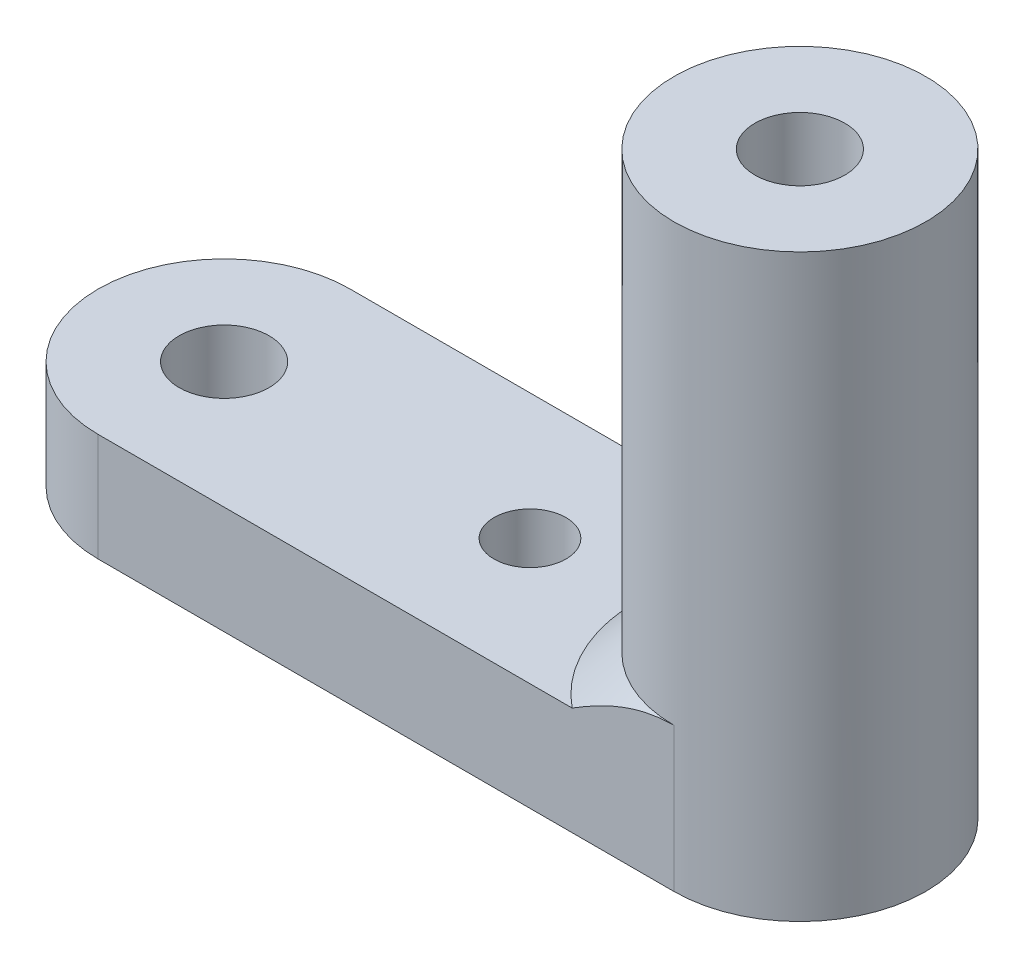
ISO-10303-21;
HEADER;
FILE_DESCRIPTION(('STEP AP214'),'2;1');
FILE_NAME('part.step','',(''),(''),'','','');
FILE_SCHEMA(('AUTOMOTIVE_DESIGN { 1 0 10303 214 1 1 1 1 }'));
ENDSEC;
DATA;
#1=APPLICATION_CONTEXT('core data for automotive mechanical design processes');
#2=APPLICATION_PROTOCOL_DEFINITION('international standard','automotive_design',2000,#1);
#3=PRODUCT_CONTEXT('',#1,'mechanical');
#4=PRODUCT('Part','Part','',(#3));
#5=PRODUCT_RELATED_PRODUCT_CATEGORY('part','',(#4));
#6=PRODUCT_DEFINITION_FORMATION('','',#4);
#7=PRODUCT_DEFINITION_CONTEXT('part definition',#1,'design');
#8=PRODUCT_DEFINITION('design','',#6,#7);
#9=PRODUCT_DEFINITION_SHAPE('','',#8);
#10=(LENGTH_UNIT() NAMED_UNIT(*) SI_UNIT(.MILLI.,.METRE.));
#11=(NAMED_UNIT(*) PLANE_ANGLE_UNIT() SI_UNIT($,.RADIAN.));
#12=(NAMED_UNIT(*) SI_UNIT($,.STERADIAN.) SOLID_ANGLE_UNIT());
#13=UNCERTAINTY_MEASURE_WITH_UNIT(LENGTH_MEASURE(1.E-05),#10,'distance_accuracy_value','');
#14=(GEOMETRIC_REPRESENTATION_CONTEXT(3) GLOBAL_UNCERTAINTY_ASSIGNED_CONTEXT((#13)) GLOBAL_UNIT_ASSIGNED_CONTEXT((#10,
#11,#12)) REPRESENTATION_CONTEXT('',''));
#15=CARTESIAN_POINT('',(0.,0.,0.));
#16=DIRECTION('',(0.,0.,1.));
#17=DIRECTION('',(1.,0.,0.));
#18=AXIS2_PLACEMENT_3D('',#15,#16,#17);
#19=CARTESIAN_POINT('',(16.,3.,0.));
#20=DIRECTION('',(0.,-1.,0.));
#21=DIRECTION('',(0.,0.,-1.));
#22=AXIS2_PLACEMENT_3D('',#19,#20,#21);
#23=CYLINDRICAL_SURFACE('',#22,3.5);
#24=CARTESIAN_POINT('',(16.,4.,0.));
#25=DIRECTION('',(0.,1.,0.));
#26=DIRECTION('',(0.,0.,1.));
#27=AXIS2_PLACEMENT_3D('',#24,#25,#26);
#28=CIRCLE('',#27,3.5);
#29=CARTESIAN_POINT('',(16.,4.,-3.5));
#30=VERTEX_POINT('',#29);
#31=CARTESIAN_POINT('',(16.,4.,3.5));
#32=VERTEX_POINT('',#31);
#33=EDGE_CURVE('E150',#30,#32,#28,.T.);
#34=ORIENTED_EDGE('',*,*,#33,.T.);
#35=DIRECTION('',(0.,-1.,0.));
#36=VECTOR('',#35,1.);
#37=CARTESIAN_POINT('',(16.,3.,3.5));
#38=LINE('',#37,#36);
#39=CARTESIAN_POINT('',(16.,0.,3.5));
#40=VERTEX_POINT('',#39);
#41=EDGE_CURVE('E131',#32,#40,#38,.T.);
#42=ORIENTED_EDGE('',*,*,#41,.T.);
#43=CARTESIAN_POINT('',(16.,0.,0.));
#44=DIRECTION('',(0.,1.,0.));
#45=DIRECTION('',(0.,0.,1.));
#46=AXIS2_PLACEMENT_3D('',#43,#44,#45);
#47=CIRCLE('',#46,3.5);
#48=CARTESIAN_POINT('',(16.,0.,-3.5));
#49=VERTEX_POINT('',#48);
#50=EDGE_CURVE('E135',#49,#40,#47,.F.);
#51=ORIENTED_EDGE('',*,*,#50,.F.);
#52=DIRECTION('',(0.,-1.,0.));
#53=VECTOR('',#52,1.);
#54=CARTESIAN_POINT('',(16.,3.,-3.5));
#55=LINE('',#54,#53);
#56=EDGE_CURVE('E108',#30,#49,#55,.T.);
#57=ORIENTED_EDGE('',*,*,#56,.F.);
#58=EDGE_LOOP('',(#34,#42,#51,#57));
#59=FACE_BOUND('',#58,.T.);
#60=CARTESIAN_POINT('',(16.,16.1151068024003,0.));
#61=DIRECTION('',(0.,1.,0.));
#62=DIRECTION('',(0.,0.,1.));
#63=AXIS2_PLACEMENT_3D('',#60,#61,#62);
#64=CIRCLE('',#63,3.5);
#65=CARTESIAN_POINT('',(16.,16.1151068024003,3.5));
#66=VERTEX_POINT('',#65);
#67=EDGE_CURVE('E136',#66,#66,#64,.T.);
#68=ORIENTED_EDGE('',*,*,#67,.F.);
#69=EDGE_LOOP('',(#68));
#70=FACE_BOUND('',#69,.T.);
#71=ADVANCED_FACE('F45',(#59,#70),#23,.T.);
#72=CARTESIAN_POINT('',(0.,3.,-3.5));
#73=DIRECTION('',(0.,0.,-1.));
#74=DIRECTION('',(-1.,0.,0.));
#75=AXIS2_PLACEMENT_3D('',#72,#73,#74);
#76=PLANE('',#75);
#77=DIRECTION('',(1.,0.,0.));
#78=VECTOR('',#77,1.);
#79=CARTESIAN_POINT('',(0.,0.,-3.5));
#80=LINE('',#79,#78);
#81=CARTESIAN_POINT('',(0.,0.,-3.5));
#82=VERTEX_POINT('',#81);
#83=EDGE_CURVE('E104',#82,#49,#80,.T.);
#84=ORIENTED_EDGE('',*,*,#83,.F.);
#85=DIRECTION('',(0.,-1.,0.));
#86=VECTOR('',#85,1.);
#87=CARTESIAN_POINT('',(0.,3.,-3.5));
#88=LINE('',#87,#86);
#89=CARTESIAN_POINT('',(0.,3.,-3.5));
#90=VERTEX_POINT('',#89);
#91=EDGE_CURVE('E98',#90,#82,#88,.T.);
#92=ORIENTED_EDGE('',*,*,#91,.F.);
#93=DIRECTION('',(1.,0.,0.));
#94=VECTOR('',#93,1.);
#95=CARTESIAN_POINT('',(0.,3.,-3.5));
#96=LINE('',#95,#94);
#97=CARTESIAN_POINT('',(13.1715728752538,3.,-3.5));
#98=VERTEX_POINT('',#97);
#99=EDGE_CURVE('E101',#90,#98,#96,.T.);
#100=ORIENTED_EDGE('',*,*,#99,.T.);
#101=CARTESIAN_POINT('',(13.1715728752538,3.,-3.5));
#102=CARTESIAN_POINT('',(13.2370337040906,3.04114067553144,-3.5));
#103=CARTESIAN_POINT('',(13.3028792901203,3.08166771179054,-3.5));
#104=CARTESIAN_POINT('',(13.435434251496,3.16131542271247,-3.5));
#105=CARTESIAN_POINT('',(13.50214381138,3.20043578995185,-3.5));
#106=CARTESIAN_POINT('',(13.70408685699,3.31563115199628,-3.5));
#107=CARTESIAN_POINT('',(13.8407265210776,3.38928084921466,-3.5));
#108=CARTESIAN_POINT('',(14.1146603782416,3.52623493399622,-3.5));
#109=CARTESIAN_POINT('',(14.2518432205454,3.58976015003224,-3.5));
#110=CARTESIAN_POINT('',(14.5305628640055,3.70615583669083,-3.5));
#111=CARTESIAN_POINT('',(14.6720942404452,3.75903900696463,-3.5));
#112=CARTESIAN_POINT('',(14.9106325683467,3.83548621399932,-3.5));
#113=CARTESIAN_POINT('',(15.006403006878,3.86290368827248,-3.5));
#114=CARTESIAN_POINT('',(15.1996379282252,3.91087398484766,-3.5));
#115=CARTESIAN_POINT('',(15.2971019037422,3.93142882679007,-3.5));
#116=CARTESIAN_POINT('',(15.4950052415431,3.96512109387094,-3.5));
#117=CARTESIAN_POINT('',(15.5954671249457,3.97812932483156,-3.5));
#118=CARTESIAN_POINT('',(15.7467747349747,3.99121308081721,-3.5));
#119=CARTESIAN_POINT('',(15.7973577389456,3.99450295746182,-3.5));
#120=CARTESIAN_POINT('',(15.898624943103,3.99889825793051,-3.5));
#121=CARTESIAN_POINT('',(15.9493091555773,4.00000339803709,-3.5));
#122=CARTESIAN_POINT('',(16.,4.,-3.5));
#123=B_SPLINE_CURVE_WITH_KNOTS('',3,(#101,#102,#103,#104,#105,#106,#107,#108,#109,#110,#111,
#112,#113,#114,#115,#116,#117,#118,#119,#120,#121,#122),.UNSPECIFIED.,.F.,.F.,(4,2,2,2,2,2,2,2,
2,2,4),(0.,0.23193900357315,0.463928392411356,0.92935705715041,1.38256726115525,
1.83523337845953,2.13387240048051,2.43242345681239,2.73594523801048,2.88797324793645,
3.04002099945293),.UNSPECIFIED.);
#124=EDGE_CURVE('E11',#98,#30,#123,.T.);
#125=ORIENTED_EDGE('',*,*,#124,.T.);
#126=ORIENTED_EDGE('',*,*,#56,.T.);
#127=EDGE_LOOP('',(#84,#92,#100,#125,#126));
#128=FACE_BOUND('',#127,.T.);
#129=ADVANCED_FACE('F100',(#128),#76,.T.);
#130=CARTESIAN_POINT('',(0.,3.,0.));
#131=DIRECTION('',(0.,-1.,0.));
#132=DIRECTION('',(0.,0.,-1.));
#133=AXIS2_PLACEMENT_3D('',#130,#131,#132);
#134=CYLINDRICAL_SURFACE('',#133,3.5);
#135=CARTESIAN_POINT('',(0.,0.,0.));
#136=DIRECTION('',(0.,1.,0.));
#137=DIRECTION('',(0.,0.,1.));
#138=AXIS2_PLACEMENT_3D('',#135,#136,#137);
#139=CIRCLE('',#138,3.5);
#140=CARTESIAN_POINT('',(0.,0.,3.5));
#141=VERTEX_POINT('',#140);
#142=EDGE_CURVE('E140',#82,#141,#139,.T.);
#143=ORIENTED_EDGE('',*,*,#142,.T.);
#144=DIRECTION('',(0.,-1.,0.));
#145=VECTOR('',#144,1.);
#146=CARTESIAN_POINT('',(0.,3.,3.5));
#147=LINE('',#146,#145);
#148=CARTESIAN_POINT('',(0.,3.,3.5));
#149=VERTEX_POINT('',#148);
#150=EDGE_CURVE('E109',#149,#141,#147,.T.);
#151=ORIENTED_EDGE('',*,*,#150,.F.);
#152=CARTESIAN_POINT('',(0.,3.,0.));
#153=DIRECTION('',(0.,1.,0.));
#154=DIRECTION('',(0.,0.,1.));
#155=AXIS2_PLACEMENT_3D('',#152,#153,#154);
#156=CIRCLE('',#155,3.5);
#157=EDGE_CURVE('E113',#90,#149,#156,.T.);
#158=ORIENTED_EDGE('',*,*,#157,.F.);
#159=ORIENTED_EDGE('',*,*,#91,.T.);
#160=EDGE_LOOP('',(#143,#151,#158,#159));
#161=FACE_BOUND('',#160,.T.);
#162=ADVANCED_FACE('F114',(#161),#134,.T.);
#163=CARTESIAN_POINT('',(0.,3.,3.5));
#164=DIRECTION('',(0.,0.,-1.));
#165=DIRECTION('',(-1.,0.,0.));
#166=AXIS2_PLACEMENT_3D('',#163,#164,#165);
#167=PLANE('',#166);
#168=DIRECTION('',(1.,0.,0.));
#169=VECTOR('',#168,1.);
#170=CARTESIAN_POINT('',(0.,0.,3.5));
#171=LINE('',#170,#169);
#172=EDGE_CURVE('E142',#141,#40,#171,.T.);
#173=ORIENTED_EDGE('',*,*,#172,.T.);
#174=ORIENTED_EDGE('',*,*,#41,.F.);
#175=CARTESIAN_POINT('',(16.,4.,3.5));
#176=CARTESIAN_POINT('',(15.946187444806,4.00000433886439,3.5));
#177=CARTESIAN_POINT('',(15.8923828618998,3.99875832799262,3.5));
#178=CARTESIAN_POINT('',(15.7848955008554,3.99380638844776,3.5));
#179=CARTESIAN_POINT('',(15.7312127043506,3.99010085940805,3.5));
#180=CARTESIAN_POINT('',(15.5707082561854,3.97537651702064,3.5));
#181=CARTESIAN_POINT('',(15.4641999902364,3.9607495984901,3.5));
#182=CARTESIAN_POINT('',(15.254612287954,3.92297050809595,3.5));
#183=CARTESIAN_POINT('',(15.151505335073,3.89996714137538,3.5));
#184=CARTESIAN_POINT('',(14.9472447917268,3.84643023182709,3.5));
#185=CARTESIAN_POINT('',(14.8460920076959,3.81589364891354,3.5));
#186=CARTESIAN_POINT('',(14.6086149947421,3.73579963961617,3.5));
#187=CARTESIAN_POINT('',(14.4732547029234,3.68339685989787,3.5));
#188=CARTESIAN_POINT('',(14.2065390550882,3.56910229056239,3.5));
#189=CARTESIAN_POINT('',(14.0751873582831,3.50720212467849,3.5));
#190=CARTESIAN_POINT('',(13.812935311875,3.37445277995993,3.5));
#191=CARTESIAN_POINT('',(13.6821301133526,3.30341709584337,3.5));
#192=CARTESIAN_POINT('',(13.4886475945269,3.19255112253515,3.5));
#193=CARTESIAN_POINT('',(13.4246868749258,3.15492739337366,3.5));
#194=CARTESIAN_POINT('',(13.2975569455379,3.07839077779461,3.5));
#195=CARTESIAN_POINT('',(13.2343875908641,3.03947813225657,3.5));
#196=CARTESIAN_POINT('',(13.1715728752538,3.,3.5));
#197=B_SPLINE_CURVE_WITH_KNOTS('',3,(#175,#176,#177,#178,#179,#180,#181,#182,#183,#184,#185,
#186,#187,#188,#189,#190,#191,#192,#193,#194,#195,#196),.UNSPECIFIED.,.F.,.F.,(4,2,2,2,2,2,2,2,
2,2,4),(0.,0.161408007905509,0.322789795943298,0.644864313022839,0.961476105837962,
1.27821587933091,1.71317501919807,2.14852000225426,2.59485803896076,2.81746425278889,
3.04002909694148),.UNSPECIFIED.);
#198=CARTESIAN_POINT('',(13.1715728752538,3.,3.5));
#199=VERTEX_POINT('',#198);
#200=EDGE_CURVE('E60',#32,#199,#197,.T.);
#201=ORIENTED_EDGE('',*,*,#200,.T.);
#202=DIRECTION('',(1.,0.,0.));
#203=VECTOR('',#202,1.);
#204=CARTESIAN_POINT('',(0.,3.,3.5));
#205=LINE('',#204,#203);
#206=EDGE_CURVE('E116',#149,#199,#205,.T.);
#207=ORIENTED_EDGE('',*,*,#206,.F.);
#208=ORIENTED_EDGE('',*,*,#150,.T.);
#209=EDGE_LOOP('',(#173,#174,#201,#207,#208));
#210=FACE_BOUND('',#209,.T.);
#211=ADVANCED_FACE('F158',(#210),#167,.F.);
#212=CARTESIAN_POINT('',(8.5,3.,0.));
#213=DIRECTION('',(0.,-1.,0.));
#214=DIRECTION('',(0.,0.,-1.));
#215=AXIS2_PLACEMENT_3D('',#212,#213,#214);
#216=CYLINDRICAL_SURFACE('',#215,1.);
#217=CARTESIAN_POINT('',(8.5,3.,0.));
#218=DIRECTION('',(0.,1.,0.));
#219=DIRECTION('',(0.,0.,1.));
#220=AXIS2_PLACEMENT_3D('',#217,#218,#219);
#221=CIRCLE('',#220,1.);
#222=CARTESIAN_POINT('',(8.5,3.,1.));
#223=VERTEX_POINT('',#222);
#224=EDGE_CURVE('E120',#223,#223,#221,.T.);
#225=ORIENTED_EDGE('',*,*,#224,.T.);
#226=EDGE_LOOP('',(#225));
#227=FACE_BOUND('',#226,.T.);
#228=CARTESIAN_POINT('',(8.5,0.,0.));
#229=DIRECTION('',(0.,1.,0.));
#230=DIRECTION('',(0.,0.,1.));
#231=AXIS2_PLACEMENT_3D('',#228,#229,#230);
#232=CIRCLE('',#231,1.);
#233=CARTESIAN_POINT('',(8.5,0.,1.));
#234=VERTEX_POINT('',#233);
#235=EDGE_CURVE('E132',#234,#234,#232,.T.);
#236=ORIENTED_EDGE('',*,*,#235,.F.);
#237=EDGE_LOOP('',(#236));
#238=FACE_BOUND('',#237,.T.);
#239=ADVANCED_FACE('F163',(#227,#238),#216,.F.);
#240=CARTESIAN_POINT('',(0.,3.,0.));
#241=DIRECTION('',(0.,-1.,0.));
#242=DIRECTION('',(0.,0.,-1.));
#243=AXIS2_PLACEMENT_3D('',#240,#241,#242);
#244=CYLINDRICAL_SURFACE('',#243,1.25);
#245=CARTESIAN_POINT('',(0.,3.,0.));
#246=DIRECTION('',(0.,1.,0.));
#247=DIRECTION('',(0.,0.,1.));
#248=AXIS2_PLACEMENT_3D('',#245,#246,#247);
#249=CIRCLE('',#248,1.25);
#250=CARTESIAN_POINT('',(0.,3.,1.25));
#251=VERTEX_POINT('',#250);
#252=EDGE_CURVE('E128',#251,#251,#249,.T.);
#253=ORIENTED_EDGE('',*,*,#252,.T.);
#254=EDGE_LOOP('',(#253));
#255=FACE_BOUND('',#254,.T.);
#256=CARTESIAN_POINT('',(0.,0.,0.));
#257=DIRECTION('',(0.,1.,0.));
#258=DIRECTION('',(0.,0.,1.));
#259=AXIS2_PLACEMENT_3D('',#256,#257,#258);
#260=CIRCLE('',#259,1.25);
#261=CARTESIAN_POINT('',(0.,0.,1.25));
#262=VERTEX_POINT('',#261);
#263=EDGE_CURVE('E123',#262,#262,#260,.T.);
#264=ORIENTED_EDGE('',*,*,#263,.F.);
#265=EDGE_LOOP('',(#264));
#266=FACE_BOUND('',#265,.T.);
#267=ADVANCED_FACE('F164',(#255,#266),#244,.F.);
#268=CARTESIAN_POINT('',(0.,3.,0.));
#269=DIRECTION('',(0.,1.,0.));
#270=DIRECTION('',(0.,0.,1.));
#271=AXIS2_PLACEMENT_3D('',#268,#269,#270);
#272=PLANE('',#271);
#273=ORIENTED_EDGE('',*,*,#206,.T.);
#274=CARTESIAN_POINT('',(16.,3.,0.));
#275=DIRECTION('',(0.,1.,0.));
#276=DIRECTION('',(0.,0.,1.));
#277=AXIS2_PLACEMENT_3D('',#274,#275,#276);
#278=CIRCLE('',#277,4.49999999999999);
#279=EDGE_CURVE('E73',#199,#98,#278,.F.);
#280=ORIENTED_EDGE('',*,*,#279,.T.);
#281=ORIENTED_EDGE('',*,*,#99,.F.);
#282=ORIENTED_EDGE('',*,*,#157,.T.);
#283=EDGE_LOOP('',(#273,#280,#281,#282));
#284=FACE_BOUND('',#283,.T.);
#285=ORIENTED_EDGE('',*,*,#224,.F.);
#286=EDGE_LOOP('',(#285));
#287=FACE_BOUND('',#286,.T.);
#288=ORIENTED_EDGE('',*,*,#252,.F.);
#289=EDGE_LOOP('',(#288));
#290=FACE_BOUND('',#289,.T.);
#291=ADVANCED_FACE('F118',(#284,#287,#290),#272,.T.);
#292=CARTESIAN_POINT('',(0.,0.,0.));
#293=DIRECTION('',(0.,1.,0.));
#294=DIRECTION('',(0.,0.,1.));
#295=AXIS2_PLACEMENT_3D('',#292,#293,#294);
#296=PLANE('',#295);
#297=CARTESIAN_POINT('',(16.,0.,0.));
#298=DIRECTION('',(0.,1.,0.));
#299=DIRECTION('',(0.,0.,1.));
#300=AXIS2_PLACEMENT_3D('',#297,#298,#299);
#301=CIRCLE('',#300,1.25);
#302=CARTESIAN_POINT('',(16.,0.,1.25));
#303=VERTEX_POINT('',#302);
#304=EDGE_CURVE('E274',#303,#303,#301,.T.);
#305=ORIENTED_EDGE('',*,*,#304,.T.);
#306=EDGE_LOOP('',(#305));
#307=FACE_BOUND('',#306,.T.);
#308=ORIENTED_EDGE('',*,*,#235,.T.);
#309=EDGE_LOOP('',(#308));
#310=FACE_BOUND('',#309,.T.);
#311=ORIENTED_EDGE('',*,*,#50,.T.);
#312=ORIENTED_EDGE('',*,*,#172,.F.);
#313=ORIENTED_EDGE('',*,*,#142,.F.);
#314=ORIENTED_EDGE('',*,*,#83,.T.);
#315=EDGE_LOOP('',(#311,#312,#313,#314));
#316=FACE_BOUND('',#315,.T.);
#317=ORIENTED_EDGE('',*,*,#263,.T.);
#318=EDGE_LOOP('',(#317));
#319=FACE_BOUND('',#318,.T.);
#320=ADVANCED_FACE('F182',(#307,#310,#316,#319),#296,.F.);
#321=CARTESIAN_POINT('',(16.,16.1151068024003,0.));
#322=DIRECTION('',(0.,1.,0.));
#323=DIRECTION('',(0.,0.,1.));
#324=AXIS2_PLACEMENT_3D('',#321,#322,#323);
#325=PLANE('',#324);
#326=CARTESIAN_POINT('',(16.,16.1151068024003,0.));
#327=DIRECTION('',(0.,1.,0.));
#328=DIRECTION('',(0.,0.,1.));
#329=AXIS2_PLACEMENT_3D('',#326,#327,#328);
#330=CIRCLE('',#329,1.25);
#331=CARTESIAN_POINT('',(16.,16.1151068024003,1.25));
#332=VERTEX_POINT('',#331);
#333=EDGE_CURVE('E277',#332,#332,#330,.T.);
#334=ORIENTED_EDGE('',*,*,#333,.F.);
#335=EDGE_LOOP('',(#334));
#336=FACE_BOUND('',#335,.T.);
#337=ORIENTED_EDGE('',*,*,#67,.T.);
#338=EDGE_LOOP('',(#337));
#339=FACE_BOUND('',#338,.T.);
#340=ADVANCED_FACE('F185',(#336,#339),#325,.T.);
#341=CARTESIAN_POINT('',(16.,0.,0.));
#342=DIRECTION('',(0.,1.,0.));
#343=DIRECTION('',(0.,0.,1.));
#344=AXIS2_PLACEMENT_3D('',#341,#342,#343);
#345=CYLINDRICAL_SURFACE('',#344,1.25);
#346=ORIENTED_EDGE('',*,*,#304,.F.);
#347=EDGE_LOOP('',(#346));
#348=FACE_BOUND('',#347,.T.);
#349=ORIENTED_EDGE('',*,*,#333,.T.);
#350=EDGE_LOOP('',(#349));
#351=FACE_BOUND('',#350,.T.);
#352=ADVANCED_FACE('F195',(#348,#351),#345,.F.);
#353=CARTESIAN_POINT('',(16.,4.,0.));
#354=DIRECTION('',(0.,-1.,0.));
#355=DIRECTION('',(0.,0.,-1.));
#356=AXIS2_PLACEMENT_3D('',#353,#354,#355);
#357=CONICAL_SURFACE('',#356,3.5,0.785398163397442);
#358=ORIENTED_EDGE('',*,*,#124,.F.);
#359=ORIENTED_EDGE('',*,*,#279,.F.);
#360=ORIENTED_EDGE('',*,*,#200,.F.);
#361=ORIENTED_EDGE('',*,*,#33,.F.);
#362=EDGE_LOOP('',(#358,#359,#360,#361));
#363=FACE_BOUND('',#362,.T.);
#364=ADVANCED_FACE('F48',(#363),#357,.T.);
#365=CLOSED_SHELL('',(#71,#129,#162,#211,#239,#267,#291,#320,#340,#352,#364));
#366=MANIFOLD_SOLID_BREP('B2',#365);
#367=ADVANCED_BREP_SHAPE_REPRESENTATION('',(#18,#366),#14);
#368=SHAPE_DEFINITION_REPRESENTATION(#9,#367);
ENDSEC;
END-ISO-10303-21;
